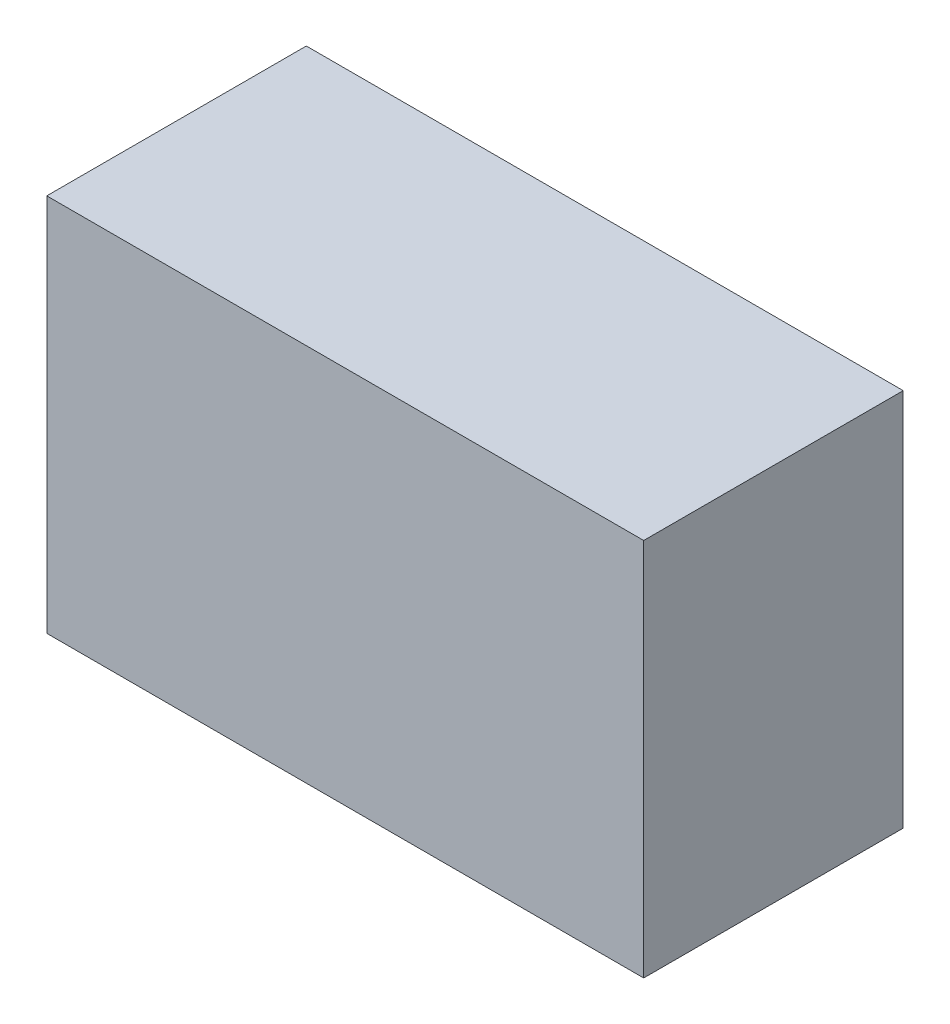
ISO-10303-21;
HEADER;
FILE_DESCRIPTION(('STEP AP214'),'2;1');
FILE_NAME('part.step','',(''),(''),'','','');
FILE_SCHEMA(('AUTOMOTIVE_DESIGN { 1 0 10303 214 1 1 1 1 }'));
ENDSEC;
DATA;
#1=APPLICATION_CONTEXT('core data for automotive mechanical design processes');
#2=APPLICATION_PROTOCOL_DEFINITION('international standard','automotive_design',2000,#1);
#3=PRODUCT_CONTEXT('',#1,'mechanical');
#4=PRODUCT('Part','Part','',(#3));
#5=PRODUCT_RELATED_PRODUCT_CATEGORY('part','',(#4));
#6=PRODUCT_DEFINITION_FORMATION('','',#4);
#7=PRODUCT_DEFINITION_CONTEXT('part definition',#1,'design');
#8=PRODUCT_DEFINITION('design','',#6,#7);
#9=PRODUCT_DEFINITION_SHAPE('','',#8);
#10=(LENGTH_UNIT() NAMED_UNIT(*) SI_UNIT(.MILLI.,.METRE.));
#11=(NAMED_UNIT(*) PLANE_ANGLE_UNIT() SI_UNIT($,.RADIAN.));
#12=(NAMED_UNIT(*) SI_UNIT($,.STERADIAN.) SOLID_ANGLE_UNIT());
#13=UNCERTAINTY_MEASURE_WITH_UNIT(LENGTH_MEASURE(1.E-05),#10,'distance_accuracy_value','');
#14=(GEOMETRIC_REPRESENTATION_CONTEXT(3) GLOBAL_UNCERTAINTY_ASSIGNED_CONTEXT((#13)) GLOBAL_UNIT_ASSIGNED_CONTEXT((#10,
#11,#12)) REPRESENTATION_CONTEXT('',''));
#15=CARTESIAN_POINT('',(0.,0.,0.));
#16=DIRECTION('',(0.,0.,1.));
#17=DIRECTION('',(1.,0.,0.));
#18=AXIS2_PLACEMENT_3D('',#15,#16,#17);
#19=CARTESIAN_POINT('',(0.,0.,0.));
#20=DIRECTION('',(0.,0.,1.));
#21=DIRECTION('',(1.,0.,0.));
#22=AXIS2_PLACEMENT_3D('',#19,#20,#21);
#23=PLANE('',#22);
#24=DIRECTION('',(0.,1.,0.));
#25=VECTOR('',#24,1.);
#26=CARTESIAN_POINT('',(-9.42,10.04,0.));
#27=LINE('',#26,#25);
#28=CARTESIAN_POINT('',(-9.42,12.23,0.));
#29=VERTEX_POINT('',#28);
#30=CARTESIAN_POINT('',(-9.42,10.04,0.));
#31=VERTEX_POINT('',#30);
#32=EDGE_CURVE('E58',#29,#31,#27,.F.);
#33=ORIENTED_EDGE('',*,*,#32,.F.);
#34=DIRECTION('',(1.,0.,0.));
#35=VECTOR('',#34,1.);
#36=CARTESIAN_POINT('',(-9.42,12.23,0.));
#37=LINE('',#36,#35);
#38=CARTESIAN_POINT('',(-12.87,12.23,0.));
#39=VERTEX_POINT('',#38);
#40=EDGE_CURVE('E53',#39,#29,#37,.T.);
#41=ORIENTED_EDGE('',*,*,#40,.F.);
#42=DIRECTION('',(0.,1.,0.));
#43=VECTOR('',#42,1.);
#44=CARTESIAN_POINT('',(-12.87,12.23,0.));
#45=LINE('',#44,#43);
#46=CARTESIAN_POINT('',(-12.87,10.04,0.));
#47=VERTEX_POINT('',#46);
#48=EDGE_CURVE('E68',#47,#39,#45,.T.);
#49=ORIENTED_EDGE('',*,*,#48,.F.);
#50=DIRECTION('',(1.,0.,0.));
#51=VECTOR('',#50,1.);
#52=CARTESIAN_POINT('',(-12.87,10.04,0.));
#53=LINE('',#52,#51);
#54=EDGE_CURVE('E20',#31,#47,#53,.F.);
#55=ORIENTED_EDGE('',*,*,#54,.F.);
#56=EDGE_LOOP('',(#33,#41,#49,#55));
#57=FACE_BOUND('',#56,.T.);
#58=ADVANCED_FACE('F17',(#57),#23,.T.);
#59=CARTESIAN_POINT('',(-12.87,10.04,-1.5));
#60=DIRECTION('',(0.,-1.,0.));
#61=DIRECTION('',(0.,0.,-1.));
#62=AXIS2_PLACEMENT_3D('',#59,#60,#61);
#63=PLANE('',#62);
#64=DIRECTION('',(1.,0.,0.));
#65=VECTOR('',#64,1.);
#66=CARTESIAN_POINT('',(0.,10.04,-1.5));
#67=LINE('',#66,#65);
#68=CARTESIAN_POINT('',(-12.87,10.04,-1.5));
#69=VERTEX_POINT('',#68);
#70=CARTESIAN_POINT('',(-9.42,10.04,-1.5));
#71=VERTEX_POINT('',#70);
#72=EDGE_CURVE('E74',#69,#71,#67,.T.);
#73=ORIENTED_EDGE('',*,*,#72,.T.);
#74=DIRECTION('',(0.,0.,-1.));
#75=VECTOR('',#74,1.);
#76=CARTESIAN_POINT('',(-9.42,10.04,-1.5));
#77=LINE('',#76,#75);
#78=EDGE_CURVE('E63',#31,#71,#77,.T.);
#79=ORIENTED_EDGE('',*,*,#78,.F.);
#80=ORIENTED_EDGE('',*,*,#54,.T.);
#81=DIRECTION('',(0.,0.,1.));
#82=VECTOR('',#81,1.);
#83=CARTESIAN_POINT('',(-12.87,10.04,-1.5));
#84=LINE('',#83,#82);
#85=EDGE_CURVE('E81',#69,#47,#84,.T.);
#86=ORIENTED_EDGE('',*,*,#85,.F.);
#87=EDGE_LOOP('',(#73,#79,#80,#86));
#88=FACE_BOUND('',#87,.T.);
#89=ADVANCED_FACE('F73',(#88),#63,.T.);
#90=CARTESIAN_POINT('',(-9.42,10.04,-1.5));
#91=DIRECTION('',(1.,0.,0.));
#92=DIRECTION('',(0.,0.,-1.));
#93=AXIS2_PLACEMENT_3D('',#90,#91,#92);
#94=PLANE('',#93);
#95=DIRECTION('',(0.,1.,0.));
#96=VECTOR('',#95,1.);
#97=CARTESIAN_POINT('',(-9.42,0.,-1.5));
#98=LINE('',#97,#96);
#99=CARTESIAN_POINT('',(-9.42,12.23,-1.5));
#100=VERTEX_POINT('',#99);
#101=EDGE_CURVE('E84',#71,#100,#98,.T.);
#102=ORIENTED_EDGE('',*,*,#101,.T.);
#103=DIRECTION('',(0.,0.,1.));
#104=VECTOR('',#103,1.);
#105=CARTESIAN_POINT('',(-9.42,12.23,-1.5));
#106=LINE('',#105,#104);
#107=EDGE_CURVE('E65',#29,#100,#106,.F.);
#108=ORIENTED_EDGE('',*,*,#107,.F.);
#109=ORIENTED_EDGE('',*,*,#32,.T.);
#110=ORIENTED_EDGE('',*,*,#78,.T.);
#111=EDGE_LOOP('',(#102,#108,#109,#110));
#112=FACE_BOUND('',#111,.T.);
#113=ADVANCED_FACE('F61',(#112),#94,.T.);
#114=CARTESIAN_POINT('',(-9.42,12.23,-1.5));
#115=DIRECTION('',(0.,1.,0.));
#116=DIRECTION('',(0.,0.,1.));
#117=AXIS2_PLACEMENT_3D('',#114,#115,#116);
#118=PLANE('',#117);
#119=DIRECTION('',(1.,0.,0.));
#120=VECTOR('',#119,1.);
#121=CARTESIAN_POINT('',(0.,12.23,-1.5));
#122=LINE('',#121,#120);
#123=CARTESIAN_POINT('',(-12.87,12.23,-1.5));
#124=VERTEX_POINT('',#123);
#125=EDGE_CURVE('E26',#100,#124,#122,.F.);
#126=ORIENTED_EDGE('',*,*,#125,.T.);
#127=DIRECTION('',(0.,0.,1.));
#128=VECTOR('',#127,1.);
#129=CARTESIAN_POINT('',(-12.87,12.23,-1.5));
#130=LINE('',#129,#128);
#131=EDGE_CURVE('E34',#39,#124,#130,.F.);
#132=ORIENTED_EDGE('',*,*,#131,.F.);
#133=ORIENTED_EDGE('',*,*,#40,.T.);
#134=ORIENTED_EDGE('',*,*,#107,.T.);
#135=EDGE_LOOP('',(#126,#132,#133,#134));
#136=FACE_BOUND('',#135,.T.);
#137=ADVANCED_FACE('F88',(#136),#118,.T.);
#138=CARTESIAN_POINT('',(-12.87,12.23,-1.5));
#139=DIRECTION('',(-1.,0.,0.));
#140=DIRECTION('',(0.,0.,1.));
#141=AXIS2_PLACEMENT_3D('',#138,#139,#140);
#142=PLANE('',#141);
#143=DIRECTION('',(0.,1.,0.));
#144=VECTOR('',#143,1.);
#145=CARTESIAN_POINT('',(-12.87,0.,-1.5));
#146=LINE('',#145,#144);
#147=EDGE_CURVE('E11',#124,#69,#146,.F.);
#148=ORIENTED_EDGE('',*,*,#147,.T.);
#149=ORIENTED_EDGE('',*,*,#85,.T.);
#150=ORIENTED_EDGE('',*,*,#48,.T.);
#151=ORIENTED_EDGE('',*,*,#131,.T.);
#152=EDGE_LOOP('',(#148,#149,#150,#151));
#153=FACE_BOUND('',#152,.T.);
#154=ADVANCED_FACE('F91',(#153),#142,.T.);
#155=CARTESIAN_POINT('',(0.,0.,-1.5));
#156=DIRECTION('',(0.,0.,1.));
#157=DIRECTION('',(1.,0.,0.));
#158=AXIS2_PLACEMENT_3D('',#155,#156,#157);
#159=PLANE('',#158);
#160=ORIENTED_EDGE('',*,*,#125,.F.);
#161=ORIENTED_EDGE('',*,*,#101,.F.);
#162=ORIENTED_EDGE('',*,*,#72,.F.);
#163=ORIENTED_EDGE('',*,*,#147,.F.);
#164=EDGE_LOOP('',(#160,#161,#162,#163));
#165=FACE_BOUND('',#164,.T.);
#166=ADVANCED_FACE('F90',(#165),#159,.F.);
#167=CLOSED_SHELL('',(#58,#89,#113,#137,#154,#166));
#168=MANIFOLD_SOLID_BREP('B1',#167);
#169=ADVANCED_BREP_SHAPE_REPRESENTATION('',(#18,#168),#14);
#170=SHAPE_DEFINITION_REPRESENTATION(#9,#169);
ENDSEC;
END-ISO-10303-21;
